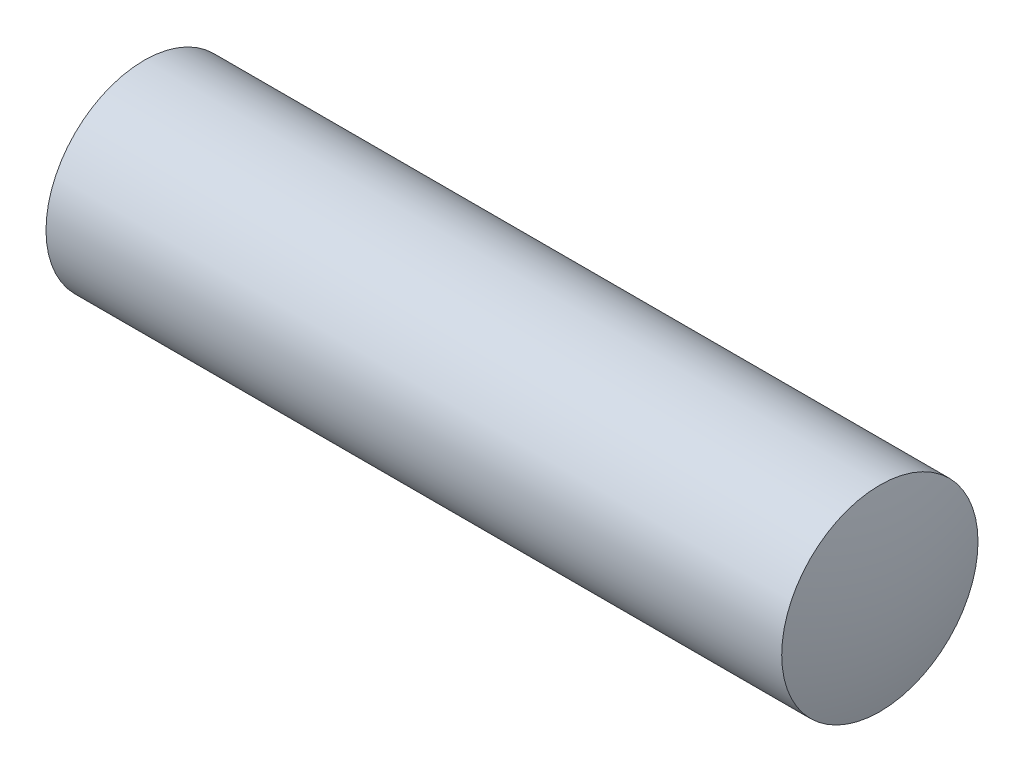
ISO-10303-21;
HEADER;
FILE_DESCRIPTION(('STEP AP214'),'2;1');
FILE_NAME('part.step','',(''),(''),'','','');
FILE_SCHEMA(('AUTOMOTIVE_DESIGN { 1 0 10303 214 1 1 1 1 }'));
ENDSEC;
DATA;
#1=APPLICATION_CONTEXT('core data for automotive mechanical design processes');
#2=APPLICATION_PROTOCOL_DEFINITION('international standard','automotive_design',2000,#1);
#3=PRODUCT_CONTEXT('',#1,'mechanical');
#4=PRODUCT('Part','Part','',(#3));
#5=PRODUCT_RELATED_PRODUCT_CATEGORY('part','',(#4));
#6=PRODUCT_DEFINITION_FORMATION('','',#4);
#7=PRODUCT_DEFINITION_CONTEXT('part definition',#1,'design');
#8=PRODUCT_DEFINITION('design','',#6,#7);
#9=PRODUCT_DEFINITION_SHAPE('','',#8);
#10=(LENGTH_UNIT() NAMED_UNIT(*) SI_UNIT(.MILLI.,.METRE.));
#11=(NAMED_UNIT(*) PLANE_ANGLE_UNIT() SI_UNIT($,.RADIAN.));
#12=(NAMED_UNIT(*) SI_UNIT($,.STERADIAN.) SOLID_ANGLE_UNIT());
#13=UNCERTAINTY_MEASURE_WITH_UNIT(LENGTH_MEASURE(1.E-05),#10,'distance_accuracy_value','');
#14=(GEOMETRIC_REPRESENTATION_CONTEXT(3) GLOBAL_UNCERTAINTY_ASSIGNED_CONTEXT((#13)) GLOBAL_UNIT_ASSIGNED_CONTEXT((#10,
#11,#12)) REPRESENTATION_CONTEXT('',''));
#15=CARTESIAN_POINT('',(0.,0.,0.));
#16=DIRECTION('',(0.,0.,1.));
#17=DIRECTION('',(1.,0.,0.));
#18=AXIS2_PLACEMENT_3D('',#15,#16,#17);
#19=CARTESIAN_POINT('',(16.2224847327077,6.72047543624635,-13.1172308945789));
#20=DIRECTION('',(1.,0.,0.));
#21=DIRECTION('',(0.,0.,-1.));
#22=AXIS2_PLACEMENT_3D('',#19,#20,#21);
#23=CYLINDRICAL_SURFACE('',#22,3.175);
#24=CARTESIAN_POINT('',(41.9141128843334,6.72047543624653,-13.1172308945789));
#25=DIRECTION('',(-1.,0.,0.));
#26=DIRECTION('',(0.,-1.,0.));
#27=AXIS2_PLACEMENT_3D('',#24,#25,#26);
#28=CIRCLE('',#27,3.175);
#29=CARTESIAN_POINT('',(41.9141128843334,3.54547543624653,-13.1172308945789));
#30=VERTEX_POINT('',#29);
#31=EDGE_CURVE('E69',#30,#30,#28,.T.);
#32=ORIENTED_EDGE('',*,*,#31,.T.);
#33=EDGE_LOOP('',(#32));
#34=FACE_BOUND('',#33,.T.);
#35=CARTESIAN_POINT('',(18.1144186359163,6.72047543624636,-13.1172308945789));
#36=DIRECTION('',(-1.,0.,0.));
#37=DIRECTION('',(0.,-1.,0.));
#38=AXIS2_PLACEMENT_3D('',#35,#36,#37);
#39=CIRCLE('',#38,3.175);
#40=CARTESIAN_POINT('',(18.1144186359163,3.54547543624636,-13.1172308945789));
#41=VERTEX_POINT('',#40);
#42=EDGE_CURVE('E72',#41,#41,#39,.T.);
#43=ORIENTED_EDGE('',*,*,#42,.F.);
#44=EDGE_LOOP('',(#43));
#45=FACE_BOUND('',#44,.T.);
#46=ADVANCED_FACE('F48',(#34,#45),#23,.T.);
#47=CARTESIAN_POINT('',(29.6173907601248,6.72047543624644,-13.1172308945789));
#48=DIRECTION('',(-1.,0.,0.));
#49=DIRECTION('',(0.,0.,1.));
#50=AXIS2_PLACEMENT_3D('',#47,#48,#49);
#51=SPHERICAL_SURFACE('',#50,12.7);
#52=CARTESIAN_POINT('',(42.3173907601248,6.72047543624653,-13.1172308945789));
#53=VERTEX_POINT('',#52);
#54=VERTEX_LOOP('',#53);
#55=FACE_BOUND('',#54,.T.);
#56=ORIENTED_EDGE('',*,*,#31,.F.);
#57=EDGE_LOOP('',(#56));
#58=FACE_BOUND('',#57,.T.);
#59=ADVANCED_FACE('F62',(#55,#58),#51,.T.);
#60=CARTESIAN_POINT('',(30.4111407601248,6.72047543624645,-13.1172308945789));
#61=DIRECTION('',(-1.,0.,0.));
#62=DIRECTION('',(0.,0.,-1.));
#63=AXIS2_PLACEMENT_3D('',#60,#61,#62);
#64=SPHERICAL_SURFACE('',#63,12.7);
#65=CARTESIAN_POINT('',(17.7111407601248,6.72047543624636,-13.1172308945789));
#66=VERTEX_POINT('',#65);
#67=VERTEX_LOOP('',#66);
#68=FACE_BOUND('',#67,.T.);
#69=ORIENTED_EDGE('',*,*,#42,.T.);
#70=EDGE_LOOP('',(#69));
#71=FACE_BOUND('',#70,.T.);
#72=ADVANCED_FACE('F65',(#68,#71),#64,.T.);
#73=CLOSED_SHELL('',(#46,#59,#72));
#74=CARTESIAN_POINT('',(20.8861407601248,6.72047543624635,-13.1172308945789));
#75=DIRECTION('',(1.,0.,0.));
#76=DIRECTION('',(0.,1.,0.));
#77=AXIS2_PLACEMENT_3D('',#74,#75,#76);
#78=PLANE('',#77);
#79=CARTESIAN_POINT('',(20.8861407601248,6.72047543624638,-13.1172308945789));
#80=DIRECTION('',(1.,0.,0.));
#81=DIRECTION('',(0.,1.,0.));
#82=AXIS2_PLACEMENT_3D('',#79,#80,#81);
#83=CIRCLE('',#82,2.37490000000003);
#84=CARTESIAN_POINT('',(20.8861407601248,9.0953754362464,-13.1172308945789));
#85=VERTEX_POINT('',#84);
#86=EDGE_CURVE('E87',#85,#85,#83,.T.);
#87=ORIENTED_EDGE('',*,*,#86,.F.);
#88=EDGE_LOOP('',(#87));
#89=FACE_BOUND('',#88,.T.);
#90=CARTESIAN_POINT('',(20.8861407601248,6.72047543624638,-13.1172308945789));
#91=DIRECTION('',(-1.,0.,0.));
#92=DIRECTION('',(0.,0.,1.));
#93=AXIS2_PLACEMENT_3D('',#90,#91,#92);
#94=CIRCLE('',#93,1.93039999999999);
#95=CARTESIAN_POINT('',(20.8861407601248,6.72047543624638,-11.1868308945789));
#96=VERTEX_POINT('',#95);
#97=EDGE_CURVE('E79',#96,#96,#94,.T.);
#98=ORIENTED_EDGE('',*,*,#97,.F.);
#99=EDGE_LOOP('',(#98));
#100=FACE_BOUND('',#99,.T.);
#101=ADVANCED_FACE('F113',(#89,#100),#78,.F.);
#102=CARTESIAN_POINT('',(20.1180784623902,6.72047543624637,-13.1172308945789));
#103=DIRECTION('',(1.,0.,0.));
#104=DIRECTION('',(0.,1.,0.));
#105=AXIS2_PLACEMENT_3D('',#102,#103,#104);
#106=CYLINDRICAL_SURFACE('',#105,2.37490000000016);
#107=CARTESIAN_POINT('',(39.5392657601248,6.72047543624651,-13.1172308945789));
#108=DIRECTION('',(-1.,0.,0.));
#109=DIRECTION('',(0.,-1.,0.));
#110=AXIS2_PLACEMENT_3D('',#107,#108,#109);
#111=CIRCLE('',#110,2.37490000000016);
#112=CARTESIAN_POINT('',(39.5392657601248,4.34557543624634,-13.1172308945789));
#113=VERTEX_POINT('',#112);
#114=EDGE_CURVE('E76',#113,#113,#111,.F.);
#115=ORIENTED_EDGE('',*,*,#114,.T.);
#116=EDGE_LOOP('',(#115));
#117=FACE_BOUND('',#116,.T.);
#118=CARTESIAN_POINT('',(39.1423907601248,6.7204754362465,-13.1172308945789));
#119=DIRECTION('',(1.,0.,0.));
#120=DIRECTION('',(0.,1.,0.));
#121=AXIS2_PLACEMENT_3D('',#118,#119,#120);
#122=CIRCLE('',#121,2.37490000000015);
#123=CARTESIAN_POINT('',(39.1423907601248,9.09537543624666,-13.1172308945789));
#124=VERTEX_POINT('',#123);
#125=EDGE_CURVE('E56',#124,#124,#122,.T.);
#126=ORIENTED_EDGE('',*,*,#125,.F.);
#127=EDGE_LOOP('',(#126));
#128=FACE_BOUND('',#127,.T.);
#129=ADVANCED_FACE('F97',(#117,#128),#106,.F.);
#130=CARTESIAN_POINT('',(39.1423907601248,4.34557543624635,-13.1172308945789));
#131=DIRECTION('',(-1.,0.,0.));
#132=DIRECTION('',(0.,-1.,0.));
#133=AXIS2_PLACEMENT_3D('',#130,#131,#132);
#134=PLANE('',#133);
#135=CARTESIAN_POINT('',(39.1423907601248,6.72047543624638,-13.1172308945789));
#136=DIRECTION('',(-1.,0.,0.));
#137=DIRECTION('',(0.,-1.,0.));
#138=AXIS2_PLACEMENT_3D('',#135,#136,#137);
#139=CIRCLE('',#138,1.93039999999999);
#140=CARTESIAN_POINT('',(39.1423907601248,4.79007543624638,-13.1172308945789));
#141=VERTEX_POINT('',#140);
#142=EDGE_CURVE('E83',#141,#141,#139,.T.);
#143=ORIENTED_EDGE('',*,*,#142,.T.);
#144=EDGE_LOOP('',(#143));
#145=FACE_BOUND('',#144,.T.);
#146=ORIENTED_EDGE('',*,*,#125,.T.);
#147=EDGE_LOOP('',(#146));
#148=FACE_BOUND('',#147,.T.);
#149=ADVANCED_FACE('F120',(#145,#148),#134,.F.);
#150=CARTESIAN_POINT('',(20.1180784623902,6.72047543624637,-13.1172308945789));
#151=DIRECTION('',(1.,0.,0.));
#152=DIRECTION('',(0.,1.,0.));
#153=AXIS2_PLACEMENT_3D('',#150,#151,#152);
#154=CYLINDRICAL_SURFACE('',#153,2.37490000000002);
#155=CARTESIAN_POINT('',(20.4892657601248,6.72047543624637,-13.1172308945789));
#156=DIRECTION('',(1.,0.,0.));
#157=DIRECTION('',(0.,1.,0.));
#158=AXIS2_PLACEMENT_3D('',#155,#156,#157);
#159=CIRCLE('',#158,2.37490000000002);
#160=CARTESIAN_POINT('',(20.4892657601248,9.09537543624639,-13.1172308945789));
#161=VERTEX_POINT('',#160);
#162=EDGE_CURVE('E11',#161,#161,#159,.T.);
#163=ORIENTED_EDGE('',*,*,#162,.F.);
#164=EDGE_LOOP('',(#163));
#165=FACE_BOUND('',#164,.T.);
#166=ORIENTED_EDGE('',*,*,#86,.T.);
#167=EDGE_LOOP('',(#166));
#168=FACE_BOUND('',#167,.T.);
#169=ADVANCED_FACE('F110',(#165,#168),#154,.F.);
#170=CARTESIAN_POINT('',(20.8861407601248,6.72047543624638,-13.1172308945789));
#171=DIRECTION('',(-1.,0.,0.));
#172=DIRECTION('',(0.,0.,1.));
#173=AXIS2_PLACEMENT_3D('',#170,#171,#172);
#174=CYLINDRICAL_SURFACE('',#173,1.93039999999999);
#175=ORIENTED_EDGE('',*,*,#142,.F.);
#176=EDGE_LOOP('',(#175));
#177=FACE_BOUND('',#176,.T.);
#178=ORIENTED_EDGE('',*,*,#97,.T.);
#179=EDGE_LOOP('',(#178));
#180=FACE_BOUND('',#179,.T.);
#181=ADVANCED_FACE('F103',(#177,#180),#174,.F.);
#182=CARTESIAN_POINT('',(39.5392657601248,4.3328754362465,-13.1172308945789));
#183=DIRECTION('',(-1.,0.,0.));
#184=DIRECTION('',(0.,0.,-1.));
#185=AXIS2_PLACEMENT_3D('',#182,#183,#184);
#186=PLANE('',#185);
#187=ORIENTED_EDGE('',*,*,#114,.F.);
#188=EDGE_LOOP('',(#187));
#189=FACE_BOUND('',#188,.T.);
#190=ADVANCED_FACE('F100',(#189),#186,.T.);
#191=CARTESIAN_POINT('',(20.4892657601248,9.10807543624638,-13.1172308945789));
#192=DIRECTION('',(1.,0.,0.));
#193=DIRECTION('',(0.,0.,-1.));
#194=AXIS2_PLACEMENT_3D('',#191,#192,#193);
#195=PLANE('',#194);
#196=ORIENTED_EDGE('',*,*,#162,.T.);
#197=EDGE_LOOP('',(#196));
#198=FACE_BOUND('',#197,.T.);
#199=ADVANCED_FACE('F102',(#198),#195,.T.);
#200=CLOSED_SHELL('',(#101,#129,#149,#169,#181,#190,#199));
#201=ORIENTED_CLOSED_SHELL('',*,#200,.T.);
#202=BREP_WITH_VOIDS('B2',#73,(#201));
#203=ADVANCED_BREP_SHAPE_REPRESENTATION('',(#18,#202),#14);
#204=SHAPE_DEFINITION_REPRESENTATION(#9,#203);
ENDSEC;
END-ISO-10303-21;
